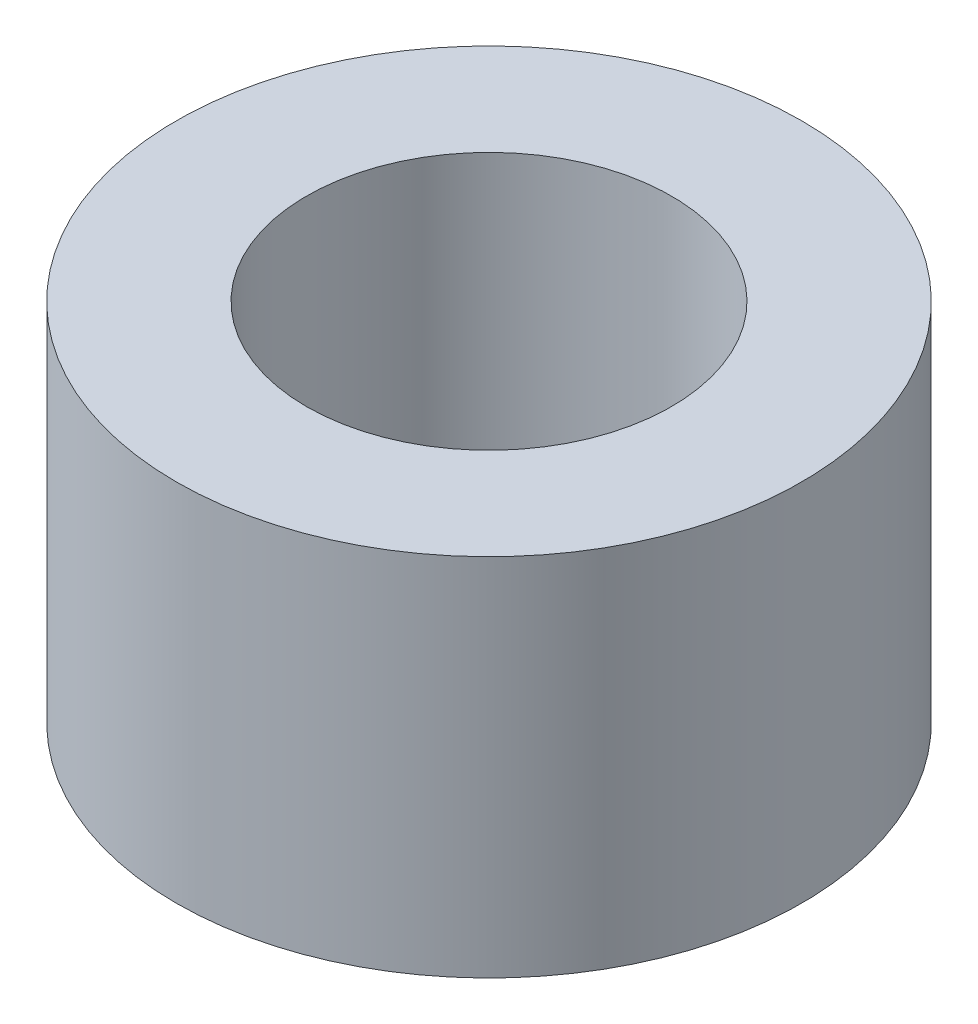
ISO-10303-21;
HEADER;
FILE_DESCRIPTION(('STEP AP214'),'2;1');
FILE_NAME('part.step','',(''),(''),'','','');
FILE_SCHEMA(('AUTOMOTIVE_DESIGN { 1 0 10303 214 1 1 1 1 }'));
ENDSEC;
DATA;
#1=APPLICATION_CONTEXT('core data for automotive mechanical design processes');
#2=APPLICATION_PROTOCOL_DEFINITION('international standard','automotive_design',2000,#1);
#3=PRODUCT_CONTEXT('',#1,'mechanical');
#4=PRODUCT('Part','Part','',(#3));
#5=PRODUCT_RELATED_PRODUCT_CATEGORY('part','',(#4));
#6=PRODUCT_DEFINITION_FORMATION('','',#4);
#7=PRODUCT_DEFINITION_CONTEXT('part definition',#1,'design');
#8=PRODUCT_DEFINITION('design','',#6,#7);
#9=PRODUCT_DEFINITION_SHAPE('','',#8);
#10=(LENGTH_UNIT() NAMED_UNIT(*) SI_UNIT(.MILLI.,.METRE.));
#11=(NAMED_UNIT(*) PLANE_ANGLE_UNIT() SI_UNIT($,.RADIAN.));
#12=(NAMED_UNIT(*) SI_UNIT($,.STERADIAN.) SOLID_ANGLE_UNIT());
#13=UNCERTAINTY_MEASURE_WITH_UNIT(LENGTH_MEASURE(1.E-05),#10,'distance_accuracy_value','');
#14=(GEOMETRIC_REPRESENTATION_CONTEXT(3) GLOBAL_UNCERTAINTY_ASSIGNED_CONTEXT((#13)) GLOBAL_UNIT_ASSIGNED_CONTEXT((#10,
#11,#12)) REPRESENTATION_CONTEXT('',''));
#15=CARTESIAN_POINT('',(0.,0.,0.));
#16=DIRECTION('',(0.,0.,1.));
#17=DIRECTION('',(1.,0.,0.));
#18=AXIS2_PLACEMENT_3D('',#15,#16,#17);
#19=CARTESIAN_POINT('',(0.,3.5,0.));
#20=DIRECTION('',(0.,1.,0.));
#21=DIRECTION('',(0.,0.,1.));
#22=AXIS2_PLACEMENT_3D('',#19,#20,#21);
#23=PLANE('',#22);
#24=CARTESIAN_POINT('',(0.,3.5,0.));
#25=DIRECTION('',(0.,1.,0.));
#26=DIRECTION('',(0.,0.,1.));
#27=AXIS2_PLACEMENT_3D('',#24,#25,#26);
#28=CIRCLE('',#27,3.);
#29=CARTESIAN_POINT('',(0.,3.5,3.));
#30=VERTEX_POINT('',#29);
#31=EDGE_CURVE('E10',#30,#30,#28,.T.);
#32=ORIENTED_EDGE('',*,*,#31,.T.);
#33=EDGE_LOOP('',(#32));
#34=FACE_BOUND('',#33,.T.);
#35=CARTESIAN_POINT('',(0.,3.5,0.));
#36=DIRECTION('',(0.,1.,0.));
#37=DIRECTION('',(0.,0.,1.));
#38=AXIS2_PLACEMENT_3D('',#35,#36,#37);
#39=CIRCLE('',#38,1.75);
#40=CARTESIAN_POINT('',(0.,3.5,1.75));
#41=VERTEX_POINT('',#40);
#42=EDGE_CURVE('E42',#41,#41,#39,.T.);
#43=ORIENTED_EDGE('',*,*,#42,.F.);
#44=EDGE_LOOP('',(#43));
#45=FACE_BOUND('',#44,.T.);
#46=ADVANCED_FACE('F31',(#34,#45),#23,.T.);
#47=CARTESIAN_POINT('',(0.,0.,0.));
#48=DIRECTION('',(0.,1.,0.));
#49=DIRECTION('',(0.,0.,1.));
#50=AXIS2_PLACEMENT_3D('',#47,#48,#49);
#51=PLANE('',#50);
#52=CARTESIAN_POINT('',(0.,0.,0.));
#53=DIRECTION('',(0.,1.,0.));
#54=DIRECTION('',(0.,0.,1.));
#55=AXIS2_PLACEMENT_3D('',#52,#53,#54);
#56=CIRCLE('',#55,3.);
#57=CARTESIAN_POINT('',(0.,0.,3.));
#58=VERTEX_POINT('',#57);
#59=EDGE_CURVE('E35',#58,#58,#56,.T.);
#60=ORIENTED_EDGE('',*,*,#59,.F.);
#61=EDGE_LOOP('',(#60));
#62=FACE_BOUND('',#61,.T.);
#63=CARTESIAN_POINT('',(0.,0.,0.));
#64=DIRECTION('',(0.,1.,0.));
#65=DIRECTION('',(0.,0.,1.));
#66=AXIS2_PLACEMENT_3D('',#63,#64,#65);
#67=CIRCLE('',#66,1.75);
#68=CARTESIAN_POINT('',(0.,0.,1.75));
#69=VERTEX_POINT('',#68);
#70=EDGE_CURVE('E44',#69,#69,#67,.T.);
#71=ORIENTED_EDGE('',*,*,#70,.T.);
#72=EDGE_LOOP('',(#71));
#73=FACE_BOUND('',#72,.T.);
#74=ADVANCED_FACE('F54',(#62,#73),#51,.F.);
#75=CARTESIAN_POINT('',(0.,3.5,0.));
#76=DIRECTION('',(0.,-1.,0.));
#77=DIRECTION('',(0.,0.,-1.));
#78=AXIS2_PLACEMENT_3D('',#75,#76,#77);
#79=CYLINDRICAL_SURFACE('',#78,3.);
#80=ORIENTED_EDGE('',*,*,#31,.F.);
#81=EDGE_LOOP('',(#80));
#82=FACE_BOUND('',#81,.T.);
#83=ORIENTED_EDGE('',*,*,#59,.T.);
#84=EDGE_LOOP('',(#83));
#85=FACE_BOUND('',#84,.T.);
#86=ADVANCED_FACE('F33',(#82,#85),#79,.T.);
#87=CARTESIAN_POINT('',(0.,3.5,0.));
#88=DIRECTION('',(0.,-1.,0.));
#89=DIRECTION('',(0.,0.,-1.));
#90=AXIS2_PLACEMENT_3D('',#87,#88,#89);
#91=CYLINDRICAL_SURFACE('',#90,1.75);
#92=ORIENTED_EDGE('',*,*,#42,.T.);
#93=EDGE_LOOP('',(#92));
#94=FACE_BOUND('',#93,.T.);
#95=ORIENTED_EDGE('',*,*,#70,.F.);
#96=EDGE_LOOP('',(#95));
#97=FACE_BOUND('',#96,.T.);
#98=ADVANCED_FACE('F50',(#94,#97),#91,.F.);
#99=CLOSED_SHELL('',(#46,#74,#86,#98));
#100=MANIFOLD_SOLID_BREP('B2',#99);
#101=ADVANCED_BREP_SHAPE_REPRESENTATION('',(#18,#100),#14);
#102=SHAPE_DEFINITION_REPRESENTATION(#9,#101);
ENDSEC;
END-ISO-10303-21;
